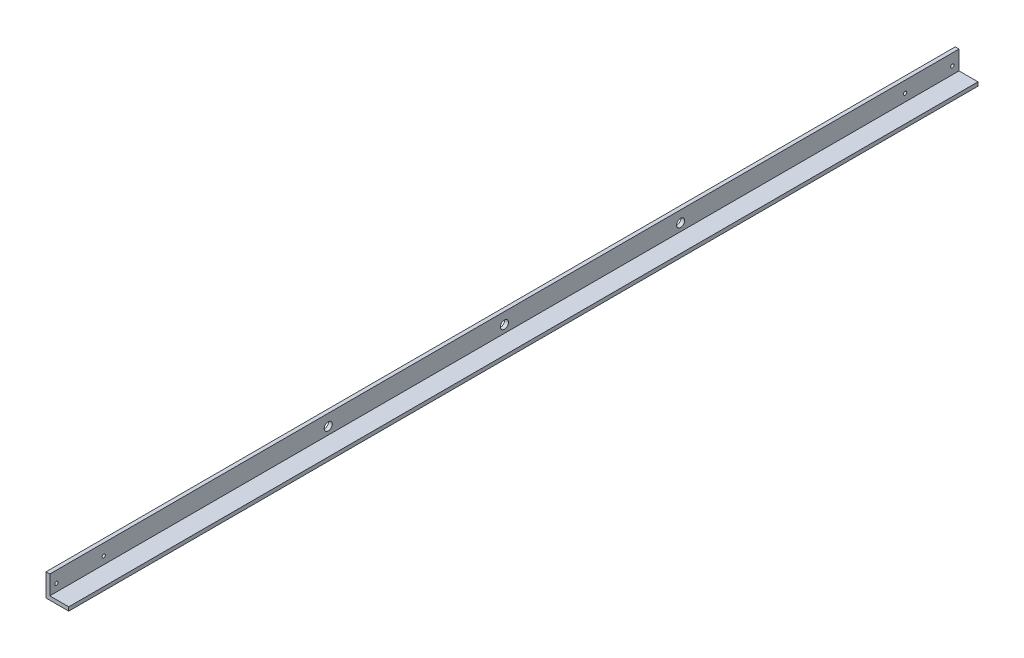
ISO-10303-21;
HEADER;
FILE_DESCRIPTION(('STEP AP214'),'2;1');
FILE_NAME('part.step','',(''),(''),'','','');
FILE_SCHEMA(('AUTOMOTIVE_DESIGN { 1 0 10303 214 1 1 1 1 }'));
ENDSEC;
DATA;
#1=APPLICATION_CONTEXT('core data for automotive mechanical design processes');
#2=APPLICATION_PROTOCOL_DEFINITION('international standard','automotive_design',2000,#1);
#3=PRODUCT_CONTEXT('',#1,'mechanical');
#4=PRODUCT('Part','Part','',(#3));
#5=PRODUCT_RELATED_PRODUCT_CATEGORY('part','',(#4));
#6=PRODUCT_DEFINITION_FORMATION('','',#4);
#7=PRODUCT_DEFINITION_CONTEXT('part definition',#1,'design');
#8=PRODUCT_DEFINITION('design','',#6,#7);
#9=PRODUCT_DEFINITION_SHAPE('','',#8);
#10=(LENGTH_UNIT() NAMED_UNIT(*) SI_UNIT(.MILLI.,.METRE.));
#11=(NAMED_UNIT(*) PLANE_ANGLE_UNIT() SI_UNIT($,.RADIAN.));
#12=(NAMED_UNIT(*) SI_UNIT($,.STERADIAN.) SOLID_ANGLE_UNIT());
#13=UNCERTAINTY_MEASURE_WITH_UNIT(LENGTH_MEASURE(1.E-05),#10,'distance_accuracy_value','');
#14=(GEOMETRIC_REPRESENTATION_CONTEXT(3) GLOBAL_UNCERTAINTY_ASSIGNED_CONTEXT((#13)) GLOBAL_UNIT_ASSIGNED_CONTEXT((#10,
#11,#12)) REPRESENTATION_CONTEXT('',''));
#15=CARTESIAN_POINT('',(0.,0.,0.));
#16=DIRECTION('',(0.,0.,1.));
#17=DIRECTION('',(1.,0.,0.));
#18=AXIS2_PLACEMENT_3D('',#15,#16,#17);
#19=CARTESIAN_POINT('',(0.,19.05,762.));
#20=DIRECTION('',(1.,0.,0.));
#21=DIRECTION('',(0.,1.,0.));
#22=AXIS2_PLACEMENT_3D('',#19,#20,#21);
#23=PLANE('',#22);
#24=CARTESIAN_POINT('',(0.,9.525,233.3625));
#25=DIRECTION('',(-1.,0.,0.));
#26=DIRECTION('',(0.,0.,1.));
#27=AXIS2_PLACEMENT_3D('',#24,#25,#26);
#28=CIRCLE('',#27,3.373501);
#29=CARTESIAN_POINT('',(0.,9.525,236.736001));
#30=VERTEX_POINT('',#29);
#31=EDGE_CURVE('E147',#30,#30,#28,.T.);
#32=ORIENTED_EDGE('',*,*,#31,.F.);
#33=EDGE_LOOP('',(#32));
#34=FACE_BOUND('',#33,.T.);
#35=CARTESIAN_POINT('',(0.,9.525,528.6375));
#36=DIRECTION('',(-1.,0.,0.));
#37=DIRECTION('',(0.,0.,1.));
#38=AXIS2_PLACEMENT_3D('',#35,#36,#37);
#39=CIRCLE('',#38,3.373501);
#40=CARTESIAN_POINT('',(0.,9.525,532.011001));
#41=VERTEX_POINT('',#40);
#42=EDGE_CURVE('E136',#41,#41,#39,.T.);
#43=ORIENTED_EDGE('',*,*,#42,.F.);
#44=EDGE_LOOP('',(#43));
#45=FACE_BOUND('',#44,.T.);
#46=CARTESIAN_POINT('',(0.,9.525,381.));
#47=DIRECTION('',(-1.,0.,0.));
#48=DIRECTION('',(0.,0.,1.));
#49=AXIS2_PLACEMENT_3D('',#46,#47,#48);
#50=CIRCLE('',#49,3.373501);
#51=CARTESIAN_POINT('',(0.,9.525,384.373501));
#52=VERTEX_POINT('',#51);
#53=EDGE_CURVE('E135',#52,#52,#50,.T.);
#54=ORIENTED_EDGE('',*,*,#53,.F.);
#55=EDGE_LOOP('',(#54));
#56=FACE_BOUND('',#55,.T.);
#57=CARTESIAN_POINT('',(0.,9.525,5.58800000000004));
#58=DIRECTION('',(-1.,0.,0.));
#59=DIRECTION('',(0.,0.,1.));
#60=AXIS2_PLACEMENT_3D('',#57,#58,#59);
#61=CIRCLE('',#60,1.39699999999999);
#62=CARTESIAN_POINT('',(0.,9.525,6.98500000000003));
#63=VERTEX_POINT('',#62);
#64=EDGE_CURVE('E152',#63,#63,#61,.T.);
#65=ORIENTED_EDGE('',*,*,#64,.F.);
#66=EDGE_LOOP('',(#65));
#67=FACE_BOUND('',#66,.T.);
#68=CARTESIAN_POINT('',(0.,9.525,45.212));
#69=DIRECTION('',(-1.,0.,0.));
#70=DIRECTION('',(0.,0.,1.));
#71=AXIS2_PLACEMENT_3D('',#68,#69,#70);
#72=CIRCLE('',#71,1.39699999999999);
#73=CARTESIAN_POINT('',(0.,9.525,46.609));
#74=VERTEX_POINT('',#73);
#75=EDGE_CURVE('E158',#74,#74,#72,.T.);
#76=ORIENTED_EDGE('',*,*,#75,.F.);
#77=EDGE_LOOP('',(#76));
#78=FACE_BOUND('',#77,.T.);
#79=CARTESIAN_POINT('',(0.,9.525,716.787));
#80=DIRECTION('',(-1.,0.,0.));
#81=DIRECTION('',(0.,0.,1.));
#82=AXIS2_PLACEMENT_3D('',#79,#80,#81);
#83=CIRCLE('',#82,1.39699999999999);
#84=CARTESIAN_POINT('',(0.,9.525,718.184));
#85=VERTEX_POINT('',#84);
#86=EDGE_CURVE('E164',#85,#85,#83,.T.);
#87=ORIENTED_EDGE('',*,*,#86,.F.);
#88=EDGE_LOOP('',(#87));
#89=FACE_BOUND('',#88,.T.);
#90=CARTESIAN_POINT('',(0.,9.525,756.412));
#91=DIRECTION('',(-1.,0.,0.));
#92=DIRECTION('',(0.,0.,1.));
#93=AXIS2_PLACEMENT_3D('',#90,#91,#92);
#94=CIRCLE('',#93,1.39699999999999);
#95=CARTESIAN_POINT('',(0.,9.525,757.809));
#96=VERTEX_POINT('',#95);
#97=EDGE_CURVE('E170',#96,#96,#94,.T.);
#98=ORIENTED_EDGE('',*,*,#97,.F.);
#99=EDGE_LOOP('',(#98));
#100=FACE_BOUND('',#99,.T.);
#101=DIRECTION('',(0.,-1.,0.));
#102=VECTOR('',#101,1.);
#103=CARTESIAN_POINT('',(0.,19.05,0.));
#104=LINE('',#103,#102);
#105=CARTESIAN_POINT('',(0.,19.05,0.));
#106=VERTEX_POINT('',#105);
#107=CARTESIAN_POINT('',(0.,0.,0.));
#108=VERTEX_POINT('',#107);
#109=EDGE_CURVE('E117',#106,#108,#104,.T.);
#110=ORIENTED_EDGE('',*,*,#109,.T.);
#111=DIRECTION('',(0.,0.,-1.));
#112=VECTOR('',#111,1.);
#113=CARTESIAN_POINT('',(0.,0.,762.));
#114=LINE('',#113,#112);
#115=CARTESIAN_POINT('',(0.,0.,762.));
#116=VERTEX_POINT('',#115);
#117=EDGE_CURVE('E11',#116,#108,#114,.T.);
#118=ORIENTED_EDGE('',*,*,#117,.F.);
#119=DIRECTION('',(0.,-1.,0.));
#120=VECTOR('',#119,1.);
#121=CARTESIAN_POINT('',(0.,19.05,762.));
#122=LINE('',#121,#120);
#123=CARTESIAN_POINT('',(0.,19.05,762.));
#124=VERTEX_POINT('',#123);
#125=EDGE_CURVE('E128',#124,#116,#122,.T.);
#126=ORIENTED_EDGE('',*,*,#125,.F.);
#127=DIRECTION('',(0.,0.,-1.));
#128=VECTOR('',#127,1.);
#129=CARTESIAN_POINT('',(0.,19.05,762.));
#130=LINE('',#129,#128);
#131=EDGE_CURVE('E113',#124,#106,#130,.T.);
#132=ORIENTED_EDGE('',*,*,#131,.T.);
#133=EDGE_LOOP('',(#110,#118,#126,#132));
#134=FACE_BOUND('',#133,.T.);
#135=ADVANCED_FACE('F31',(#34,#45,#56,#67,#78,#89,#100,#134),#23,.F.);
#136=CARTESIAN_POINT('',(0.,0.,762.));
#137=DIRECTION('',(0.,1.,0.));
#138=DIRECTION('',(0.,0.,1.));
#139=AXIS2_PLACEMENT_3D('',#136,#137,#138);
#140=PLANE('',#139);
#141=DIRECTION('',(1.,0.,0.));
#142=VECTOR('',#141,1.);
#143=CARTESIAN_POINT('',(0.,0.,0.));
#144=LINE('',#143,#142);
#145=CARTESIAN_POINT('',(19.05,0.,0.));
#146=VERTEX_POINT('',#145);
#147=EDGE_CURVE('E120',#108,#146,#144,.T.);
#148=ORIENTED_EDGE('',*,*,#147,.T.);
#149=DIRECTION('',(0.,0.,-1.));
#150=VECTOR('',#149,1.);
#151=CARTESIAN_POINT('',(19.05,0.,762.));
#152=LINE('',#151,#150);
#153=CARTESIAN_POINT('',(19.05,0.,762.));
#154=VERTEX_POINT('',#153);
#155=EDGE_CURVE('E40',#154,#146,#152,.T.);
#156=ORIENTED_EDGE('',*,*,#155,.F.);
#157=DIRECTION('',(1.,0.,0.));
#158=VECTOR('',#157,1.);
#159=CARTESIAN_POINT('',(0.,0.,762.));
#160=LINE('',#159,#158);
#161=EDGE_CURVE('E86',#116,#154,#160,.T.);
#162=ORIENTED_EDGE('',*,*,#161,.F.);
#163=ORIENTED_EDGE('',*,*,#117,.T.);
#164=EDGE_LOOP('',(#148,#156,#162,#163));
#165=FACE_BOUND('',#164,.T.);
#166=ADVANCED_FACE('F178',(#165),#140,.F.);
#167=CARTESIAN_POINT('',(19.05,0.,762.));
#168=DIRECTION('',(-1.,0.,0.));
#169=DIRECTION('',(0.,0.,1.));
#170=AXIS2_PLACEMENT_3D('',#167,#168,#169);
#171=PLANE('',#170);
#172=DIRECTION('',(0.,1.,0.));
#173=VECTOR('',#172,1.);
#174=CARTESIAN_POINT('',(19.05,0.,0.));
#175=LINE('',#174,#173);
#176=CARTESIAN_POINT('',(19.05,3.175,0.));
#177=VERTEX_POINT('',#176);
#178=EDGE_CURVE('E123',#146,#177,#175,.T.);
#179=ORIENTED_EDGE('',*,*,#178,.T.);
#180=DIRECTION('',(0.,0.,-1.));
#181=VECTOR('',#180,1.);
#182=CARTESIAN_POINT('',(19.05,3.175,762.));
#183=LINE('',#182,#181);
#184=CARTESIAN_POINT('',(19.05,3.175,762.));
#185=VERTEX_POINT('',#184);
#186=EDGE_CURVE('E108',#185,#177,#183,.T.);
#187=ORIENTED_EDGE('',*,*,#186,.F.);
#188=DIRECTION('',(0.,1.,0.));
#189=VECTOR('',#188,1.);
#190=CARTESIAN_POINT('',(19.05,0.,762.));
#191=LINE('',#190,#189);
#192=EDGE_CURVE('E99',#154,#185,#191,.T.);
#193=ORIENTED_EDGE('',*,*,#192,.F.);
#194=ORIENTED_EDGE('',*,*,#155,.T.);
#195=EDGE_LOOP('',(#179,#187,#193,#194));
#196=FACE_BOUND('',#195,.T.);
#197=ADVANCED_FACE('F181',(#196),#171,.F.);
#198=CARTESIAN_POINT('',(19.05,3.175,762.));
#199=DIRECTION('',(0.,-1.,0.));
#200=DIRECTION('',(1.,0.,0.));
#201=AXIS2_PLACEMENT_3D('',#198,#199,#200);
#202=PLANE('',#201);
#203=DIRECTION('',(-1.,0.,0.));
#204=VECTOR('',#203,1.);
#205=CARTESIAN_POINT('',(19.05,3.175,0.));
#206=LINE('',#205,#204);
#207=CARTESIAN_POINT('',(3.175,3.175,0.));
#208=VERTEX_POINT('',#207);
#209=EDGE_CURVE('E107',#177,#208,#206,.T.);
#210=ORIENTED_EDGE('',*,*,#209,.T.);
#211=DIRECTION('',(0.,0.,-1.));
#212=VECTOR('',#211,1.);
#213=CARTESIAN_POINT('',(3.175,3.175,762.));
#214=LINE('',#213,#212);
#215=CARTESIAN_POINT('',(3.175,3.175,762.));
#216=VERTEX_POINT('',#215);
#217=EDGE_CURVE('E104',#216,#208,#214,.T.);
#218=ORIENTED_EDGE('',*,*,#217,.F.);
#219=DIRECTION('',(-1.,0.,0.));
#220=VECTOR('',#219,1.);
#221=CARTESIAN_POINT('',(19.05,3.175,762.));
#222=LINE('',#221,#220);
#223=EDGE_CURVE('E93',#185,#216,#222,.T.);
#224=ORIENTED_EDGE('',*,*,#223,.F.);
#225=ORIENTED_EDGE('',*,*,#186,.T.);
#226=EDGE_LOOP('',(#210,#218,#224,#225));
#227=FACE_BOUND('',#226,.T.);
#228=ADVANCED_FACE('F105',(#227),#202,.F.);
#229=CARTESIAN_POINT('',(3.175,3.175,762.));
#230=DIRECTION('',(-1.,0.,0.));
#231=DIRECTION('',(0.,-1.,0.));
#232=AXIS2_PLACEMENT_3D('',#229,#230,#231);
#233=PLANE('',#232);
#234=CARTESIAN_POINT('',(3.175,9.525,233.3625));
#235=DIRECTION('',(-1.,0.,0.));
#236=DIRECTION('',(0.,-1.,0.));
#237=AXIS2_PLACEMENT_3D('',#234,#235,#236);
#238=CIRCLE('',#237,3.373501);
#239=CARTESIAN_POINT('',(3.175,6.151499,233.3625));
#240=VERTEX_POINT('',#239);
#241=EDGE_CURVE('E34',#240,#240,#238,.T.);
#242=ORIENTED_EDGE('',*,*,#241,.T.);
#243=EDGE_LOOP('',(#242));
#244=FACE_BOUND('',#243,.T.);
#245=CARTESIAN_POINT('',(3.175,9.525,528.6375));
#246=DIRECTION('',(-1.,0.,0.));
#247=DIRECTION('',(0.,-1.,0.));
#248=AXIS2_PLACEMENT_3D('',#245,#246,#247);
#249=CIRCLE('',#248,3.373501);
#250=CARTESIAN_POINT('',(3.175,6.151499,528.6375));
#251=VERTEX_POINT('',#250);
#252=EDGE_CURVE('E133',#251,#251,#249,.T.);
#253=ORIENTED_EDGE('',*,*,#252,.T.);
#254=EDGE_LOOP('',(#253));
#255=FACE_BOUND('',#254,.T.);
#256=CARTESIAN_POINT('',(3.175,9.525,381.));
#257=DIRECTION('',(-1.,0.,0.));
#258=DIRECTION('',(0.,-1.,0.));
#259=AXIS2_PLACEMENT_3D('',#256,#257,#258);
#260=CIRCLE('',#259,3.373501);
#261=CARTESIAN_POINT('',(3.175,6.151499,381.));
#262=VERTEX_POINT('',#261);
#263=EDGE_CURVE('E140',#262,#262,#260,.T.);
#264=ORIENTED_EDGE('',*,*,#263,.T.);
#265=EDGE_LOOP('',(#264));
#266=FACE_BOUND('',#265,.T.);
#267=CARTESIAN_POINT('',(3.175,9.525,5.58800000000004));
#268=DIRECTION('',(-1.,0.,0.));
#269=DIRECTION('',(0.,-1.,0.));
#270=AXIS2_PLACEMENT_3D('',#267,#268,#269);
#271=CIRCLE('',#270,1.39699999999999);
#272=CARTESIAN_POINT('',(3.175,8.12800000000001,5.58800000000004));
#273=VERTEX_POINT('',#272);
#274=EDGE_CURVE('E155',#273,#273,#271,.T.);
#275=ORIENTED_EDGE('',*,*,#274,.T.);
#276=EDGE_LOOP('',(#275));
#277=FACE_BOUND('',#276,.T.);
#278=CARTESIAN_POINT('',(3.175,9.525,45.212));
#279=DIRECTION('',(-1.,0.,0.));
#280=DIRECTION('',(0.,-1.,0.));
#281=AXIS2_PLACEMENT_3D('',#278,#279,#280);
#282=CIRCLE('',#281,1.39699999999999);
#283=CARTESIAN_POINT('',(3.175,8.12800000000001,45.212));
#284=VERTEX_POINT('',#283);
#285=EDGE_CURVE('E161',#284,#284,#282,.T.);
#286=ORIENTED_EDGE('',*,*,#285,.T.);
#287=EDGE_LOOP('',(#286));
#288=FACE_BOUND('',#287,.T.);
#289=CARTESIAN_POINT('',(3.175,9.525,716.787));
#290=DIRECTION('',(-1.,0.,0.));
#291=DIRECTION('',(0.,-1.,0.));
#292=AXIS2_PLACEMENT_3D('',#289,#290,#291);
#293=CIRCLE('',#292,1.39699999999999);
#294=CARTESIAN_POINT('',(3.175,8.12800000000001,716.787));
#295=VERTEX_POINT('',#294);
#296=EDGE_CURVE('E167',#295,#295,#293,.T.);
#297=ORIENTED_EDGE('',*,*,#296,.T.);
#298=EDGE_LOOP('',(#297));
#299=FACE_BOUND('',#298,.T.);
#300=CARTESIAN_POINT('',(3.175,9.525,756.412));
#301=DIRECTION('',(-1.,0.,0.));
#302=DIRECTION('',(0.,-1.,0.));
#303=AXIS2_PLACEMENT_3D('',#300,#301,#302);
#304=CIRCLE('',#303,1.39699999999999);
#305=CARTESIAN_POINT('',(3.175,8.12800000000001,756.412));
#306=VERTEX_POINT('',#305);
#307=EDGE_CURVE('E121',#306,#306,#304,.T.);
#308=ORIENTED_EDGE('',*,*,#307,.T.);
#309=EDGE_LOOP('',(#308));
#310=FACE_BOUND('',#309,.T.);
#311=DIRECTION('',(0.,1.,0.));
#312=VECTOR('',#311,1.);
#313=CARTESIAN_POINT('',(3.175,3.175,0.));
#314=LINE('',#313,#312);
#315=CARTESIAN_POINT('',(3.175,19.05,0.));
#316=VERTEX_POINT('',#315);
#317=EDGE_CURVE('E72',#208,#316,#314,.T.);
#318=ORIENTED_EDGE('',*,*,#317,.T.);
#319=DIRECTION('',(0.,0.,-1.));
#320=VECTOR('',#319,1.);
#321=CARTESIAN_POINT('',(3.175,19.05,762.));
#322=LINE('',#321,#320);
#323=CARTESIAN_POINT('',(3.175,19.05,762.));
#324=VERTEX_POINT('',#323);
#325=EDGE_CURVE('E109',#324,#316,#322,.T.);
#326=ORIENTED_EDGE('',*,*,#325,.F.);
#327=DIRECTION('',(0.,1.,0.));
#328=VECTOR('',#327,1.);
#329=CARTESIAN_POINT('',(3.175,3.175,762.));
#330=LINE('',#329,#328);
#331=EDGE_CURVE('E97',#216,#324,#330,.T.);
#332=ORIENTED_EDGE('',*,*,#331,.F.);
#333=ORIENTED_EDGE('',*,*,#217,.T.);
#334=EDGE_LOOP('',(#318,#326,#332,#333));
#335=FACE_BOUND('',#334,.T.);
#336=ADVANCED_FACE('F111',(#244,#255,#266,#277,#288,#299,#310,#335),#233,.F.);
#337=CARTESIAN_POINT('',(3.175,19.05,762.));
#338=DIRECTION('',(0.,-1.,0.));
#339=DIRECTION('',(0.,0.,-1.));
#340=AXIS2_PLACEMENT_3D('',#337,#338,#339);
#341=PLANE('',#340);
#342=DIRECTION('',(-1.,0.,0.));
#343=VECTOR('',#342,1.);
#344=CARTESIAN_POINT('',(3.175,19.05,0.));
#345=LINE('',#344,#343);
#346=EDGE_CURVE('E78',#316,#106,#345,.T.);
#347=ORIENTED_EDGE('',*,*,#346,.T.);
#348=ORIENTED_EDGE('',*,*,#131,.F.);
#349=DIRECTION('',(-1.,0.,0.));
#350=VECTOR('',#349,1.);
#351=CARTESIAN_POINT('',(3.175,19.05,762.));
#352=LINE('',#351,#350);
#353=EDGE_CURVE('E49',#324,#124,#352,.T.);
#354=ORIENTED_EDGE('',*,*,#353,.F.);
#355=ORIENTED_EDGE('',*,*,#325,.T.);
#356=EDGE_LOOP('',(#347,#348,#354,#355));
#357=FACE_BOUND('',#356,.T.);
#358=ADVANCED_FACE('F186',(#357),#341,.F.);
#359=CARTESIAN_POINT('',(0.,0.,762.));
#360=DIRECTION('',(0.,0.,1.));
#361=DIRECTION('',(1.,0.,0.));
#362=AXIS2_PLACEMENT_3D('',#359,#360,#361);
#363=PLANE('',#362);
#364=ORIENTED_EDGE('',*,*,#125,.T.);
#365=ORIENTED_EDGE('',*,*,#161,.T.);
#366=ORIENTED_EDGE('',*,*,#192,.T.);
#367=ORIENTED_EDGE('',*,*,#223,.T.);
#368=ORIENTED_EDGE('',*,*,#331,.T.);
#369=ORIENTED_EDGE('',*,*,#353,.T.);
#370=EDGE_LOOP('',(#364,#365,#366,#367,#368,#369));
#371=FACE_BOUND('',#370,.T.);
#372=ADVANCED_FACE('F95',(#371),#363,.T.);
#373=CARTESIAN_POINT('',(0.,0.,0.));
#374=DIRECTION('',(0.,0.,1.));
#375=DIRECTION('',(1.,0.,0.));
#376=AXIS2_PLACEMENT_3D('',#373,#374,#375);
#377=PLANE('',#376);
#378=ORIENTED_EDGE('',*,*,#109,.F.);
#379=ORIENTED_EDGE('',*,*,#346,.F.);
#380=ORIENTED_EDGE('',*,*,#317,.F.);
#381=ORIENTED_EDGE('',*,*,#209,.F.);
#382=ORIENTED_EDGE('',*,*,#178,.F.);
#383=ORIENTED_EDGE('',*,*,#147,.F.);
#384=EDGE_LOOP('',(#378,#379,#380,#381,#382,#383));
#385=FACE_BOUND('',#384,.T.);
#386=ADVANCED_FACE('F184',(#385),#377,.F.);
#387=CARTESIAN_POINT('',(0.,9.525,756.412));
#388=DIRECTION('',(-1.,0.,0.));
#389=DIRECTION('',(0.,0.,1.));
#390=AXIS2_PLACEMENT_3D('',#387,#388,#389);
#391=CYLINDRICAL_SURFACE('',#390,1.39699999999999);
#392=ORIENTED_EDGE('',*,*,#97,.T.);
#393=EDGE_LOOP('',(#392));
#394=FACE_BOUND('',#393,.T.);
#395=ORIENTED_EDGE('',*,*,#307,.F.);
#396=EDGE_LOOP('',(#395));
#397=FACE_BOUND('',#396,.T.);
#398=ADVANCED_FACE('F216',(#394,#397),#391,.F.);
#399=CARTESIAN_POINT('',(0.,9.525,716.787));
#400=DIRECTION('',(-1.,0.,0.));
#401=DIRECTION('',(0.,0.,1.));
#402=AXIS2_PLACEMENT_3D('',#399,#400,#401);
#403=CYLINDRICAL_SURFACE('',#402,1.39699999999999);
#404=ORIENTED_EDGE('',*,*,#86,.T.);
#405=EDGE_LOOP('',(#404));
#406=FACE_BOUND('',#405,.T.);
#407=ORIENTED_EDGE('',*,*,#296,.F.);
#408=EDGE_LOOP('',(#407));
#409=FACE_BOUND('',#408,.T.);
#410=ADVANCED_FACE('F219',(#406,#409),#403,.F.);
#411=CARTESIAN_POINT('',(0.,9.525,45.212));
#412=DIRECTION('',(-1.,0.,0.));
#413=DIRECTION('',(0.,0.,1.));
#414=AXIS2_PLACEMENT_3D('',#411,#412,#413);
#415=CYLINDRICAL_SURFACE('',#414,1.39699999999999);
#416=ORIENTED_EDGE('',*,*,#75,.T.);
#417=EDGE_LOOP('',(#416));
#418=FACE_BOUND('',#417,.T.);
#419=ORIENTED_EDGE('',*,*,#285,.F.);
#420=EDGE_LOOP('',(#419));
#421=FACE_BOUND('',#420,.T.);
#422=ADVANCED_FACE('F227',(#418,#421),#415,.F.);
#423=CARTESIAN_POINT('',(0.,9.525,5.58800000000004));
#424=DIRECTION('',(-1.,0.,0.));
#425=DIRECTION('',(0.,0.,1.));
#426=AXIS2_PLACEMENT_3D('',#423,#424,#425);
#427=CYLINDRICAL_SURFACE('',#426,1.39699999999999);
#428=ORIENTED_EDGE('',*,*,#64,.T.);
#429=EDGE_LOOP('',(#428));
#430=FACE_BOUND('',#429,.T.);
#431=ORIENTED_EDGE('',*,*,#274,.F.);
#432=EDGE_LOOP('',(#431));
#433=FACE_BOUND('',#432,.T.);
#434=ADVANCED_FACE('F233',(#430,#433),#427,.F.);
#435=CARTESIAN_POINT('',(0.,9.525,381.));
#436=DIRECTION('',(-1.,0.,0.));
#437=DIRECTION('',(0.,0.,1.));
#438=AXIS2_PLACEMENT_3D('',#435,#436,#437);
#439=CYLINDRICAL_SURFACE('',#438,3.373501);
#440=ORIENTED_EDGE('',*,*,#53,.T.);
#441=EDGE_LOOP('',(#440));
#442=FACE_BOUND('',#441,.T.);
#443=ORIENTED_EDGE('',*,*,#263,.F.);
#444=EDGE_LOOP('',(#443));
#445=FACE_BOUND('',#444,.T.);
#446=ADVANCED_FACE('F237',(#442,#445),#439,.F.);
#447=CARTESIAN_POINT('',(0.,9.525,528.6375));
#448=DIRECTION('',(-1.,0.,0.));
#449=DIRECTION('',(0.,0.,1.));
#450=AXIS2_PLACEMENT_3D('',#447,#448,#449);
#451=CYLINDRICAL_SURFACE('',#450,3.373501);
#452=ORIENTED_EDGE('',*,*,#42,.T.);
#453=EDGE_LOOP('',(#452));
#454=FACE_BOUND('',#453,.T.);
#455=ORIENTED_EDGE('',*,*,#252,.F.);
#456=EDGE_LOOP('',(#455));
#457=FACE_BOUND('',#456,.T.);
#458=ADVANCED_FACE('F241',(#454,#457),#451,.F.);
#459=CARTESIAN_POINT('',(0.,9.525,233.3625));
#460=DIRECTION('',(-1.,0.,0.));
#461=DIRECTION('',(0.,0.,1.));
#462=AXIS2_PLACEMENT_3D('',#459,#460,#461);
#463=CYLINDRICAL_SURFACE('',#462,3.373501);
#464=ORIENTED_EDGE('',*,*,#31,.T.);
#465=EDGE_LOOP('',(#464));
#466=FACE_BOUND('',#465,.T.);
#467=ORIENTED_EDGE('',*,*,#241,.F.);
#468=EDGE_LOOP('',(#467));
#469=FACE_BOUND('',#468,.T.);
#470=ADVANCED_FACE('F245',(#466,#469),#463,.F.);
#471=CLOSED_SHELL('',(#135,#166,#197,#228,#336,#358,#372,#386,#398,#410,#422,#434,#446,#458,#470));
#472=MANIFOLD_SOLID_BREP('B2',#471);
#473=ADVANCED_BREP_SHAPE_REPRESENTATION('',(#18,#472),#14);
#474=SHAPE_DEFINITION_REPRESENTATION(#9,#473);
ENDSEC;
END-ISO-10303-21;
